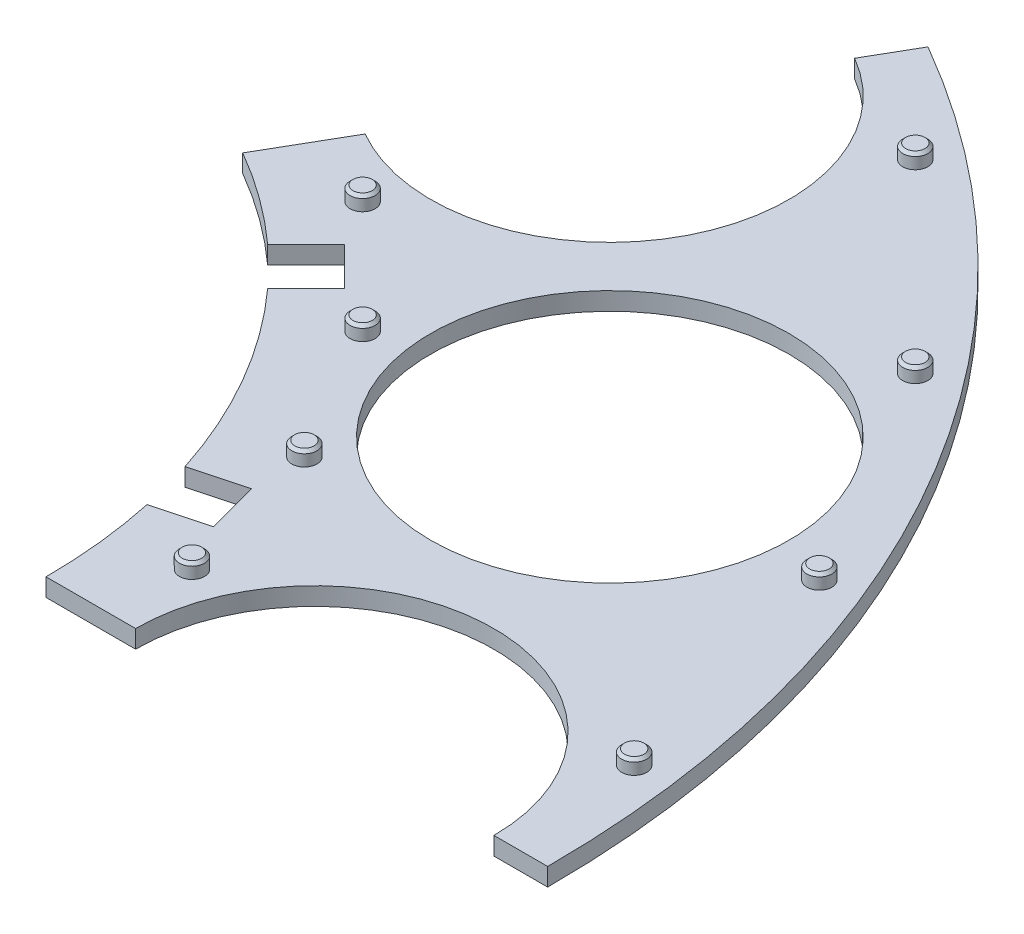
ISO-10303-21;
HEADER;
FILE_DESCRIPTION(('STEP AP214'),'2;1');
FILE_NAME('part.step','',(''),(''),'','','');
FILE_SCHEMA(('AUTOMOTIVE_DESIGN { 1 0 10303 214 1 1 1 1 }'));
ENDSEC;
DATA;
#1=APPLICATION_CONTEXT('core data for automotive mechanical design processes');
#2=APPLICATION_PROTOCOL_DEFINITION('international standard','automotive_design',2000,#1);
#3=PRODUCT_CONTEXT('',#1,'mechanical');
#4=PRODUCT('Part','Part','',(#3));
#5=PRODUCT_RELATED_PRODUCT_CATEGORY('part','',(#4));
#6=PRODUCT_DEFINITION_FORMATION('','',#4);
#7=PRODUCT_DEFINITION_CONTEXT('part definition',#1,'design');
#8=PRODUCT_DEFINITION('design','',#6,#7);
#9=PRODUCT_DEFINITION_SHAPE('','',#8);
#10=(LENGTH_UNIT() NAMED_UNIT(*) SI_UNIT(.MILLI.,.METRE.));
#11=(NAMED_UNIT(*) PLANE_ANGLE_UNIT() SI_UNIT($,.RADIAN.));
#12=(NAMED_UNIT(*) SI_UNIT($,.STERADIAN.) SOLID_ANGLE_UNIT());
#13=UNCERTAINTY_MEASURE_WITH_UNIT(LENGTH_MEASURE(1.E-05),#10,'distance_accuracy_value','');
#14=(GEOMETRIC_REPRESENTATION_CONTEXT(3) GLOBAL_UNCERTAINTY_ASSIGNED_CONTEXT((#13)) GLOBAL_UNIT_ASSIGNED_CONTEXT((#10,
#11,#12)) REPRESENTATION_CONTEXT('',''));
#15=CARTESIAN_POINT('',(0.,0.,0.));
#16=DIRECTION('',(0.,0.,1.));
#17=DIRECTION('',(1.,0.,0.));
#18=AXIS2_PLACEMENT_3D('',#15,#16,#17);
#19=CARTESIAN_POINT('',(0.,5.,0.));
#20=DIRECTION('',(0.,-1.,0.));
#21=DIRECTION('',(0.,0.,-1.));
#22=AXIS2_PLACEMENT_3D('',#19,#20,#21);
#23=CYLINDRICAL_SURFACE('',#22,150.);
#24=CARTESIAN_POINT('',(0.,0.,0.));
#25=DIRECTION('',(0.,-1.,0.));
#26=DIRECTION('',(0.,0.,1.));
#27=AXIS2_PLACEMENT_3D('',#24,#25,#26);
#28=CIRCLE('',#27,150.);
#29=CARTESIAN_POINT('',(74.9999999999997,0.,-129.903810567666));
#30=VERTEX_POINT('',#29);
#31=CARTESIAN_POINT('',(100.630050829792,0.,-111.236652547591));
#32=VERTEX_POINT('',#31);
#33=EDGE_CURVE('E177',#30,#32,#28,.T.);
#34=ORIENTED_EDGE('',*,*,#33,.T.);
#35=DIRECTION('',(0.,1.,0.));
#36=VECTOR('',#35,1.);
#37=CARTESIAN_POINT('',(100.630050829792,0.,-111.236652547591));
#38=LINE('',#37,#36);
#39=CARTESIAN_POINT('',(100.630050829792,5.,-111.236652547591));
#40=VERTEX_POINT('',#39);
#41=EDGE_CURVE('E357',#32,#40,#38,.T.);
#42=ORIENTED_EDGE('',*,*,#41,.T.);
#43=CARTESIAN_POINT('',(0.,5.,0.));
#44=DIRECTION('',(0.,-1.,0.));
#45=DIRECTION('',(0.,0.,1.));
#46=AXIS2_PLACEMENT_3D('',#43,#44,#45);
#47=CIRCLE('',#46,150.);
#48=CARTESIAN_POINT('',(74.9999999999997,5.,-129.903810567666));
#49=VERTEX_POINT('',#48);
#50=EDGE_CURVE('E305',#49,#40,#47,.T.);
#51=ORIENTED_EDGE('',*,*,#50,.F.);
#52=DIRECTION('',(0.,-1.,0.));
#53=VECTOR('',#52,1.);
#54=CARTESIAN_POINT('',(74.9999999999997,5.,-129.903810567666));
#55=LINE('',#54,#53);
#56=EDGE_CURVE('E197',#49,#30,#55,.T.);
#57=ORIENTED_EDGE('',*,*,#56,.T.);
#58=EDGE_LOOP('',(#34,#42,#51,#57));
#59=FACE_BOUND('',#58,.T.);
#60=ADVANCED_FACE('F39',(#59),#23,.F.);
#61=CARTESIAN_POINT('',(111.23665254759,5.,-100.630050829793));
#62=VERTEX_POINT('',#61);
#63=CARTESIAN_POINT('',(142.766506676515,5.,-46.0187415232604));
#64=VERTEX_POINT('',#63);
#65=EDGE_CURVE('E170',#62,#64,#47,.T.);
#66=ORIENTED_EDGE('',*,*,#65,.F.);
#67=DIRECTION('',(0.,1.,0.));
#68=VECTOR('',#67,1.);
#69=CARTESIAN_POINT('',(111.23665254759,0.,-100.630050829793));
#70=LINE('',#69,#68);
#71=CARTESIAN_POINT('',(111.23665254759,0.,-100.630050829793));
#72=VERTEX_POINT('',#71);
#73=EDGE_CURVE('E156',#72,#62,#70,.T.);
#74=ORIENTED_EDGE('',*,*,#73,.F.);
#75=CARTESIAN_POINT('',(142.766506676515,0.,-46.0187415232604));
#76=VERTEX_POINT('',#75);
#77=EDGE_CURVE('E168',#72,#76,#28,.T.);
#78=ORIENTED_EDGE('',*,*,#77,.T.);
#79=DIRECTION('',(0.,1.,0.));
#80=VECTOR('',#79,1.);
#81=CARTESIAN_POINT('',(142.766506676515,0.,-46.0187415232604));
#82=LINE('',#81,#80);
#83=EDGE_CURVE('E377',#76,#64,#82,.T.);
#84=ORIENTED_EDGE('',*,*,#83,.T.);
#85=EDGE_LOOP('',(#66,#74,#78,#84));
#86=FACE_BOUND('',#85,.T.);
#87=ADVANCED_FACE('F166',(#86),#23,.F.);
#88=CARTESIAN_POINT('',(150.,5.,0.));
#89=DIRECTION('',(0.,0.,-1.));
#90=DIRECTION('',(-1.,0.,0.));
#91=AXIS2_PLACEMENT_3D('',#88,#89,#90);
#92=PLANE('',#91);
#93=DIRECTION('',(1.,0.,0.));
#94=VECTOR('',#93,1.);
#95=CARTESIAN_POINT('',(150.,0.,0.));
#96=LINE('',#95,#94);
#97=CARTESIAN_POINT('',(150.,0.,0.));
#98=VERTEX_POINT('',#97);
#99=CARTESIAN_POINT('',(175.,0.,0.));
#100=VERTEX_POINT('',#99);
#101=EDGE_CURVE('E187',#98,#100,#96,.T.);
#102=ORIENTED_EDGE('',*,*,#101,.T.);
#103=DIRECTION('',(0.,1.,0.));
#104=VECTOR('',#103,1.);
#105=CARTESIAN_POINT('',(175.,0.,0.));
#106=LINE('',#105,#104);
#107=CARTESIAN_POINT('',(175.,5.,0.));
#108=VERTEX_POINT('',#107);
#109=EDGE_CURVE('E182',#100,#108,#106,.T.);
#110=ORIENTED_EDGE('',*,*,#109,.T.);
#111=DIRECTION('',(1.,0.,0.));
#112=VECTOR('',#111,1.);
#113=CARTESIAN_POINT('',(150.,5.,0.));
#114=LINE('',#113,#112);
#115=CARTESIAN_POINT('',(150.,5.,0.));
#116=VERTEX_POINT('',#115);
#117=EDGE_CURVE('E312',#116,#108,#114,.T.);
#118=ORIENTED_EDGE('',*,*,#117,.F.);
#119=DIRECTION('',(0.,-1.,0.));
#120=VECTOR('',#119,1.);
#121=CARTESIAN_POINT('',(150.,5.,0.));
#122=LINE('',#121,#120);
#123=EDGE_CURVE('E206',#116,#98,#122,.T.);
#124=ORIENTED_EDGE('',*,*,#123,.T.);
#125=EDGE_LOOP('',(#102,#110,#118,#124));
#126=FACE_BOUND('',#125,.T.);
#127=ADVANCED_FACE('F279',(#126),#92,.F.);
#128=CARTESIAN_POINT('',(144.999999999999,5.,-251.147367097488));
#129=DIRECTION('',(0.86602540378444,0.,0.499999999999998));
#130=DIRECTION('',(0.499999999999998,0.,-0.86602540378444));
#131=AXIS2_PLACEMENT_3D('',#128,#129,#130);
#132=PLANE('',#131);
#133=DIRECTION('',(-0.499999999999998,0.,0.86602540378444));
#134=VECTOR('',#133,1.);
#135=CARTESIAN_POINT('',(144.999999999999,0.,-251.147367097488));
#136=LINE('',#135,#134);
#137=CARTESIAN_POINT('',(144.999999999999,0.,-251.147367097488));
#138=VERTEX_POINT('',#137);
#139=CARTESIAN_POINT('',(137.499999999999,0.,-238.156986040721));
#140=VERTEX_POINT('',#139);
#141=EDGE_CURVE('E193',#138,#140,#136,.T.);
#142=ORIENTED_EDGE('',*,*,#141,.T.);
#143=DIRECTION('',(0.,1.,0.));
#144=VECTOR('',#143,1.);
#145=CARTESIAN_POINT('',(137.499999999999,0.,-238.156986040721));
#146=LINE('',#145,#144);
#147=CARTESIAN_POINT('',(137.499999999999,5.,-238.156986040721));
#148=VERTEX_POINT('',#147);
#149=EDGE_CURVE('E330',#140,#148,#146,.T.);
#150=ORIENTED_EDGE('',*,*,#149,.T.);
#151=DIRECTION('',(-0.499999999999998,0.,0.86602540378444));
#152=VECTOR('',#151,1.);
#153=CARTESIAN_POINT('',(144.999999999999,5.,-251.147367097488));
#154=LINE('',#153,#152);
#155=CARTESIAN_POINT('',(144.999999999999,5.,-251.147367097488));
#156=VERTEX_POINT('',#155);
#157=EDGE_CURVE('E185',#156,#148,#154,.T.);
#158=ORIENTED_EDGE('',*,*,#157,.F.);
#159=DIRECTION('',(0.,-1.,0.));
#160=VECTOR('',#159,1.);
#161=CARTESIAN_POINT('',(144.999999999999,5.,-251.147367097488));
#162=LINE('',#161,#160);
#163=EDGE_CURVE('E200',#156,#138,#162,.T.);
#164=ORIENTED_EDGE('',*,*,#163,.T.);
#165=EDGE_LOOP('',(#142,#150,#158,#164));
#166=FACE_BOUND('',#165,.T.);
#167=ADVANCED_FACE('F284',(#166),#132,.F.);
#168=CARTESIAN_POINT('',(146.648792353053,5.,-31.5298541289244));
#169=VERTEX_POINT('',#168);
#170=EDGE_CURVE('E196',#169,#116,#47,.T.);
#171=ORIENTED_EDGE('',*,*,#170,.F.);
#172=DIRECTION('',(0.,1.,0.));
#173=VECTOR('',#172,1.);
#174=CARTESIAN_POINT('',(146.648792353053,0.,-31.5298541289244));
#175=LINE('',#174,#173);
#176=CARTESIAN_POINT('',(146.648792353053,0.,-31.5298541289244));
#177=VERTEX_POINT('',#176);
#178=EDGE_CURVE('E298',#177,#169,#175,.T.);
#179=ORIENTED_EDGE('',*,*,#178,.F.);
#180=EDGE_CURVE('E178',#177,#98,#28,.T.);
#181=ORIENTED_EDGE('',*,*,#180,.T.);
#182=ORIENTED_EDGE('',*,*,#123,.F.);
#183=EDGE_LOOP('',(#171,#179,#181,#182));
#184=FACE_BOUND('',#183,.T.);
#185=ADVANCED_FACE('F275',(#184),#23,.F.);
#186=CARTESIAN_POINT('',(275.,5.,0.));
#187=VERTEX_POINT('',#186);
#188=CARTESIAN_POINT('',(290.,5.,0.));
#189=VERTEX_POINT('',#188);
#190=EDGE_CURVE('E309',#187,#189,#114,.T.);
#191=ORIENTED_EDGE('',*,*,#190,.F.);
#192=DIRECTION('',(0.,1.,0.));
#193=VECTOR('',#192,1.);
#194=CARTESIAN_POINT('',(275.,0.,0.));
#195=LINE('',#194,#193);
#196=CARTESIAN_POINT('',(275.,0.,0.));
#197=VERTEX_POINT('',#196);
#198=EDGE_CURVE('E332',#187,#197,#195,.F.);
#199=ORIENTED_EDGE('',*,*,#198,.T.);
#200=CARTESIAN_POINT('',(290.,0.,0.));
#201=VERTEX_POINT('',#200);
#202=EDGE_CURVE('E181',#197,#201,#96,.T.);
#203=ORIENTED_EDGE('',*,*,#202,.T.);
#204=DIRECTION('',(0.,-1.,0.));
#205=VECTOR('',#204,1.);
#206=CARTESIAN_POINT('',(290.,5.,0.));
#207=LINE('',#206,#205);
#208=EDGE_CURVE('E203',#189,#201,#207,.T.);
#209=ORIENTED_EDGE('',*,*,#208,.F.);
#210=EDGE_LOOP('',(#191,#199,#203,#209));
#211=FACE_BOUND('',#210,.T.);
#212=ADVANCED_FACE('F283',(#211),#92,.F.);
#213=CARTESIAN_POINT('',(0.,5.,0.));
#214=DIRECTION('',(0.,-1.,0.));
#215=DIRECTION('',(0.,0.,-1.));
#216=AXIS2_PLACEMENT_3D('',#213,#214,#215);
#217=CYLINDRICAL_SURFACE('',#216,290.);
#218=CARTESIAN_POINT('',(0.,0.,0.));
#219=DIRECTION('',(0.,1.,0.));
#220=DIRECTION('',(0.,0.,1.));
#221=AXIS2_PLACEMENT_3D('',#218,#219,#220);
#222=CIRCLE('',#221,290.);
#223=EDGE_CURVE('E190',#201,#138,#222,.T.);
#224=ORIENTED_EDGE('',*,*,#223,.T.);
#225=ORIENTED_EDGE('',*,*,#163,.F.);
#226=CARTESIAN_POINT('',(0.,5.,0.));
#227=DIRECTION('',(0.,1.,0.));
#228=DIRECTION('',(0.,0.,1.));
#229=AXIS2_PLACEMENT_3D('',#226,#227,#228);
#230=CIRCLE('',#229,290.);
#231=EDGE_CURVE('E316',#189,#156,#230,.T.);
#232=ORIENTED_EDGE('',*,*,#231,.F.);
#233=ORIENTED_EDGE('',*,*,#208,.T.);
#234=EDGE_LOOP('',(#224,#225,#232,#233));
#235=FACE_BOUND('',#234,.T.);
#236=ADVANCED_FACE('F290',(#235),#217,.T.);
#237=CARTESIAN_POINT('',(87.4999999999996,5.,-151.554445662277));
#238=VERTEX_POINT('',#237);
#239=EDGE_CURVE('E317',#238,#49,#154,.T.);
#240=ORIENTED_EDGE('',*,*,#239,.F.);
#241=DIRECTION('',(0.,1.,0.));
#242=VECTOR('',#241,1.);
#243=CARTESIAN_POINT('',(87.4999999999996,0.,-151.554445662277));
#244=LINE('',#243,#242);
#245=CARTESIAN_POINT('',(87.4999999999996,0.,-151.554445662277));
#246=VERTEX_POINT('',#245);
#247=EDGE_CURVE('E333',#238,#246,#244,.F.);
#248=ORIENTED_EDGE('',*,*,#247,.T.);
#249=EDGE_CURVE('E192',#246,#30,#136,.T.);
#250=ORIENTED_EDGE('',*,*,#249,.T.);
#251=ORIENTED_EDGE('',*,*,#56,.F.);
#252=EDGE_LOOP('',(#240,#248,#250,#251));
#253=FACE_BOUND('',#252,.T.);
#254=ADVANCED_FACE('F294',(#253),#132,.F.);
#255=CARTESIAN_POINT('',(0.,5.,0.));
#256=DIRECTION('',(0.,1.,0.));
#257=DIRECTION('',(0.,0.,1.));
#258=AXIS2_PLACEMENT_3D('',#255,#256,#257);
#259=PLANE('',#258);
#260=DIRECTION('',(-0.707106781186547,0.,0.707106781186548));
#261=VECTOR('',#260,1.);
#262=CARTESIAN_POINT('',(100.630050829792,5.,-111.236652547591));
#263=LINE('',#262,#261);
#264=CARTESIAN_POINT('',(111.369318036881,5.,-121.97591975468));
#265=VERTEX_POINT('',#264);
#266=EDGE_CURVE('E161',#265,#40,#263,.T.);
#267=ORIENTED_EDGE('',*,*,#266,.F.);
#268=DIRECTION('',(-0.707106781186549,0.,-0.707106781186546));
#269=VECTOR('',#268,1.);
#270=CARTESIAN_POINT('',(111.369318036881,5.,-121.97591975468));
#271=LINE('',#270,#269);
#272=CARTESIAN_POINT('',(121.975919754679,5.,-111.369318036881));
#273=VERTEX_POINT('',#272);
#274=EDGE_CURVE('E874',#273,#265,#271,.T.);
#275=ORIENTED_EDGE('',*,*,#274,.F.);
#276=DIRECTION('',(0.707106781186546,0.,-0.707106781186549));
#277=VECTOR('',#276,1.);
#278=CARTESIAN_POINT('',(121.975919754679,5.,-111.369318036881));
#279=LINE('',#278,#277);
#280=EDGE_CURVE('E388',#62,#273,#279,.T.);
#281=ORIENTED_EDGE('',*,*,#280,.F.);
#282=ORIENTED_EDGE('',*,*,#65,.T.);
#283=DIRECTION('',(-0.965925826289068,0.,0.258819045102521));
#284=VECTOR('',#283,1.);
#285=CARTESIAN_POINT('',(142.766506676515,5.,-46.0187415232604));
#286=LINE('',#285,#284);
#287=CARTESIAN_POINT('',(157.436618499427,5.,-49.9495861390841));
#288=VERTEX_POINT('',#287);
#289=EDGE_CURVE('E379',#288,#64,#286,.T.);
#290=ORIENTED_EDGE('',*,*,#289,.F.);
#291=DIRECTION('',(-0.258819045102521,0.,-0.965925826289068));
#292=VECTOR('',#291,1.);
#293=CARTESIAN_POINT('',(157.436618499427,5.,-49.9495861390841));
#294=LINE('',#293,#292);
#295=CARTESIAN_POINT('',(161.318904175965,5.,-35.4606987447481));
#296=VERTEX_POINT('',#295);
#297=EDGE_CURVE('E381',#296,#288,#294,.T.);
#298=ORIENTED_EDGE('',*,*,#297,.F.);
#299=DIRECTION('',(0.965925826289067,0.,-0.258819045102523));
#300=VECTOR('',#299,1.);
#301=CARTESIAN_POINT('',(161.318904175965,5.,-35.4606987447481));
#302=LINE('',#301,#300);
#303=EDGE_CURVE('E385',#169,#296,#302,.T.);
#304=ORIENTED_EDGE('',*,*,#303,.F.);
#305=ORIENTED_EDGE('',*,*,#170,.T.);
#306=ORIENTED_EDGE('',*,*,#117,.T.);
#307=CARTESIAN_POINT('',(225.,5.,0.));
#308=DIRECTION('',(0.,1.,0.));
#309=DIRECTION('',(0.,0.,1.));
#310=AXIS2_PLACEMENT_3D('',#307,#308,#309);
#311=CIRCLE('',#310,50.);
#312=EDGE_CURVE('E345',#187,#108,#311,.T.);
#313=ORIENTED_EDGE('',*,*,#312,.F.);
#314=ORIENTED_EDGE('',*,*,#190,.T.);
#315=ORIENTED_EDGE('',*,*,#231,.T.);
#316=ORIENTED_EDGE('',*,*,#157,.T.);
#317=CARTESIAN_POINT('',(112.499999999999,5.,-194.855715851499));
#318=DIRECTION('',(0.,1.,0.));
#319=DIRECTION('',(0.,0.,1.));
#320=AXIS2_PLACEMENT_3D('',#317,#318,#319);
#321=CIRCLE('',#320,50.);
#322=EDGE_CURVE('E327',#238,#148,#321,.T.);
#323=ORIENTED_EDGE('',*,*,#322,.F.);
#324=ORIENTED_EDGE('',*,*,#239,.T.);
#325=ORIENTED_EDGE('',*,*,#50,.T.);
#326=EDGE_LOOP('',(#267,#275,#281,#282,#290,#298,#304,#305,#306,#313,#314,#315,#316,#323,#324,#325));
#327=FACE_BOUND('',#326,.T.);
#328=CARTESIAN_POINT('',(258.68626910316,5.,-107.151361062226));
#329=DIRECTION('',(0.,1.,0.));
#330=DIRECTION('',(0.,0.,1.));
#331=AXIS2_PLACEMENT_3D('',#328,#329,#330);
#332=CIRCLE('',#331,3.50000000000002);
#333=CARTESIAN_POINT('',(258.68626910316,5.,-103.651361062226));
#334=VERTEX_POINT('',#333);
#335=EDGE_CURVE('E361',#334,#334,#332,.T.);
#336=ORIENTED_EDGE('',*,*,#335,.F.);
#337=EDGE_LOOP('',(#336));
#338=FACE_BOUND('',#337,.T.);
#339=CARTESIAN_POINT('',(222.138935281545,5.,-170.453200122442));
#340=DIRECTION('',(0.,1.,0.));
#341=DIRECTION('',(0.,0.,1.));
#342=AXIS2_PLACEMENT_3D('',#339,#340,#341);
#343=CIRCLE('',#342,3.49999999999999);
#344=CARTESIAN_POINT('',(222.138935281545,5.,-166.953200122442));
#345=VERTEX_POINT('',#344);
#346=EDGE_CURVE('E365',#345,#345,#343,.T.);
#347=ORIENTED_EDGE('',*,*,#346,.F.);
#348=EDGE_LOOP('',(#347));
#349=FACE_BOUND('',#348,.T.);
#350=CARTESIAN_POINT('',(170.453200122441,5.,-222.138935281546));
#351=DIRECTION('',(0.,1.,0.));
#352=DIRECTION('',(0.,0.,1.));
#353=AXIS2_PLACEMENT_3D('',#350,#351,#352);
#354=CIRCLE('',#353,3.49999999999999);
#355=CARTESIAN_POINT('',(170.453200122441,5.,-218.638935281546));
#356=VERTEX_POINT('',#355);
#357=EDGE_CURVE('E395',#356,#356,#354,.T.);
#358=ORIENTED_EDGE('',*,*,#357,.F.);
#359=EDGE_LOOP('',(#358));
#360=FACE_BOUND('',#359,.T.);
#361=CARTESIAN_POINT('',(103.489442931482,5.,-134.87006784951));
#362=DIRECTION('',(0.,1.,0.));
#363=DIRECTION('',(0.,0.,1.));
#364=AXIS2_PLACEMENT_3D('',#361,#362,#363);
#365=CIRCLE('',#364,3.50000000000001);
#366=CARTESIAN_POINT('',(103.489442931482,5.,-131.37006784951));
#367=VERTEX_POINT('',#366);
#368=EDGE_CURVE('E398',#367,#367,#365,.T.);
#369=ORIENTED_EDGE('',*,*,#368,.F.);
#370=EDGE_LOOP('',(#369));
#371=FACE_BOUND('',#370,.T.);
#372=CARTESIAN_POINT('',(134.87006784951,5.,-103.489442931483));
#373=DIRECTION('',(0.,1.,0.));
#374=DIRECTION('',(0.,0.,1.));
#375=AXIS2_PLACEMENT_3D('',#372,#373,#374);
#376=CIRCLE('',#375,3.49999999999999);
#377=CARTESIAN_POINT('',(134.87006784951,5.,-99.9894429314829));
#378=VERTEX_POINT('',#377);
#379=EDGE_CURVE('E401',#378,#378,#376,.T.);
#380=ORIENTED_EDGE('',*,*,#379,.F.);
#381=EDGE_LOOP('',(#380));
#382=FACE_BOUND('',#381,.T.);
#383=CARTESIAN_POINT('',(157.059520526919,5.,-65.0561835020656));
#384=DIRECTION('',(0.,1.,0.));
#385=DIRECTION('',(0.,0.,1.));
#386=AXIS2_PLACEMENT_3D('',#383,#384,#385);
#387=CIRCLE('',#386,3.49999999999999);
#388=CARTESIAN_POINT('',(157.059520526919,5.,-61.5561835020656));
#389=VERTEX_POINT('',#388);
#390=EDGE_CURVE('E404',#389,#389,#387,.T.);
#391=ORIENTED_EDGE('',*,*,#390,.F.);
#392=EDGE_LOOP('',(#391));
#393=FACE_BOUND('',#392,.T.);
#394=CARTESIAN_POINT('',(277.604561184667,5.,-36.5473338216147));
#395=DIRECTION('',(0.,1.,0.));
#396=DIRECTION('',(0.,0.,1.));
#397=AXIS2_PLACEMENT_3D('',#394,#395,#396);
#398=CIRCLE('',#397,3.50000000000002);
#399=CARTESIAN_POINT('',(277.604561184667,5.,-33.0473338216147));
#400=VERTEX_POINT('',#399);
#401=EDGE_CURVE('E407',#400,#400,#398,.T.);
#402=ORIENTED_EDGE('',*,*,#401,.F.);
#403=EDGE_LOOP('',(#402));
#404=FACE_BOUND('',#403,.T.);
#405=CARTESIAN_POINT('',(168.545626433548,5.,-22.1894526774089));
#406=DIRECTION('',(0.,1.,0.));
#407=DIRECTION('',(0.,0.,1.));
#408=AXIS2_PLACEMENT_3D('',#405,#406,#407);
#409=CIRCLE('',#408,3.49999999999999);
#410=CARTESIAN_POINT('',(168.545626433548,5.,-18.6894526774089));
#411=VERTEX_POINT('',#410);
#412=EDGE_CURVE('E410',#411,#411,#409,.T.);
#413=ORIENTED_EDGE('',*,*,#412,.F.);
#414=EDGE_LOOP('',(#413));
#415=FACE_BOUND('',#414,.T.);
#416=CARTESIAN_POINT('',(194.855715851499,5.,-112.5));
#417=DIRECTION('',(0.,1.,0.));
#418=DIRECTION('',(0.,0.,1.));
#419=AXIS2_PLACEMENT_3D('',#416,#417,#418);
#420=CIRCLE('',#419,50.);
#421=CARTESIAN_POINT('',(194.855715851499,5.,-62.5000000000003));
#422=VERTEX_POINT('',#421);
#423=EDGE_CURVE('E413',#422,#422,#420,.T.);
#424=ORIENTED_EDGE('',*,*,#423,.F.);
#425=EDGE_LOOP('',(#424));
#426=FACE_BOUND('',#425,.T.);
#427=ADVANCED_FACE('F325',(#327,#338,#349,#360,#371,#382,#393,#404,#415,#426),#259,.T.);
#428=CARTESIAN_POINT('',(0.,0.,0.));
#429=DIRECTION('',(0.,1.,0.));
#430=DIRECTION('',(0.,0.,1.));
#431=AXIS2_PLACEMENT_3D('',#428,#429,#430);
#432=PLANE('',#431);
#433=CARTESIAN_POINT('',(194.855715851499,0.,-112.5));
#434=DIRECTION('',(0.,1.,0.));
#435=DIRECTION('',(0.,0.,1.));
#436=AXIS2_PLACEMENT_3D('',#433,#434,#435);
#437=CIRCLE('',#436,50.);
#438=CARTESIAN_POINT('',(194.855715851499,0.,-62.5000000000003));
#439=VERTEX_POINT('',#438);
#440=EDGE_CURVE('E346',#439,#439,#437,.T.);
#441=ORIENTED_EDGE('',*,*,#440,.T.);
#442=EDGE_LOOP('',(#441));
#443=FACE_BOUND('',#442,.T.);
#444=DIRECTION('',(-0.707106781186549,0.,-0.707106781186546));
#445=VECTOR('',#444,1.);
#446=CARTESIAN_POINT('',(111.369318036881,0.,-121.97591975468));
#447=LINE('',#446,#445);
#448=CARTESIAN_POINT('',(121.975919754679,0.,-111.369318036881));
#449=VERTEX_POINT('',#448);
#450=CARTESIAN_POINT('',(111.369318036881,0.,-121.97591975468));
#451=VERTEX_POINT('',#450);
#452=EDGE_CURVE('E55',#449,#451,#447,.T.);
#453=ORIENTED_EDGE('',*,*,#452,.T.);
#454=DIRECTION('',(-0.707106781186547,0.,0.707106781186548));
#455=VECTOR('',#454,1.);
#456=CARTESIAN_POINT('',(100.630050829792,0.,-111.236652547591));
#457=LINE('',#456,#455);
#458=EDGE_CURVE('E171',#451,#32,#457,.T.);
#459=ORIENTED_EDGE('',*,*,#458,.T.);
#460=ORIENTED_EDGE('',*,*,#33,.F.);
#461=ORIENTED_EDGE('',*,*,#249,.F.);
#462=CARTESIAN_POINT('',(112.499999999999,0.,-194.855715851499));
#463=DIRECTION('',(0.,1.,0.));
#464=DIRECTION('',(0.,0.,1.));
#465=AXIS2_PLACEMENT_3D('',#462,#463,#464);
#466=CIRCLE('',#465,50.);
#467=EDGE_CURVE('E209',#246,#140,#466,.T.);
#468=ORIENTED_EDGE('',*,*,#467,.T.);
#469=ORIENTED_EDGE('',*,*,#141,.F.);
#470=ORIENTED_EDGE('',*,*,#223,.F.);
#471=ORIENTED_EDGE('',*,*,#202,.F.);
#472=CARTESIAN_POINT('',(225.,0.,0.));
#473=DIRECTION('',(0.,1.,0.));
#474=DIRECTION('',(0.,0.,1.));
#475=AXIS2_PLACEMENT_3D('',#472,#473,#474);
#476=CIRCLE('',#475,50.);
#477=EDGE_CURVE('E347',#197,#100,#476,.T.);
#478=ORIENTED_EDGE('',*,*,#477,.T.);
#479=ORIENTED_EDGE('',*,*,#101,.F.);
#480=ORIENTED_EDGE('',*,*,#180,.F.);
#481=DIRECTION('',(0.965925826289067,0.,-0.258819045102523));
#482=VECTOR('',#481,1.);
#483=CARTESIAN_POINT('',(161.318904175965,0.,-35.4606987447481));
#484=LINE('',#483,#482);
#485=CARTESIAN_POINT('',(161.318904175965,0.,-35.4606987447481));
#486=VERTEX_POINT('',#485);
#487=EDGE_CURVE('E382',#177,#486,#484,.T.);
#488=ORIENTED_EDGE('',*,*,#487,.T.);
#489=DIRECTION('',(-0.258819045102521,0.,-0.965925826289068));
#490=VECTOR('',#489,1.);
#491=CARTESIAN_POINT('',(157.436618499427,0.,-49.9495861390841));
#492=LINE('',#491,#490);
#493=CARTESIAN_POINT('',(157.436618499427,0.,-49.9495861390841));
#494=VERTEX_POINT('',#493);
#495=EDGE_CURVE('E63',#486,#494,#492,.T.);
#496=ORIENTED_EDGE('',*,*,#495,.T.);
#497=DIRECTION('',(-0.965925826289068,0.,0.258819045102521));
#498=VECTOR('',#497,1.);
#499=CARTESIAN_POINT('',(142.766506676515,0.,-46.0187415232604));
#500=LINE('',#499,#498);
#501=EDGE_CURVE('E176',#494,#76,#500,.T.);
#502=ORIENTED_EDGE('',*,*,#501,.T.);
#503=ORIENTED_EDGE('',*,*,#77,.F.);
#504=DIRECTION('',(0.707106781186546,0.,-0.707106781186549));
#505=VECTOR('',#504,1.);
#506=CARTESIAN_POINT('',(121.975919754679,0.,-111.369318036881));
#507=LINE('',#506,#505);
#508=EDGE_CURVE('E152',#72,#449,#507,.T.);
#509=ORIENTED_EDGE('',*,*,#508,.T.);
#510=EDGE_LOOP('',(#453,#459,#460,#461,#468,#469,#470,#471,#478,#479,#480,#488,#496,#502,#503,#509));
#511=FACE_BOUND('',#510,.T.);
#512=ADVANCED_FACE('F174',(#443,#511),#432,.F.);
#513=CARTESIAN_POINT('',(112.499999999999,0.,-194.855715851499));
#514=DIRECTION('',(0.,1.,0.));
#515=DIRECTION('',(0.,0.,1.));
#516=AXIS2_PLACEMENT_3D('',#513,#514,#515);
#517=CYLINDRICAL_SURFACE('',#516,50.);
#518=ORIENTED_EDGE('',*,*,#467,.F.);
#519=ORIENTED_EDGE('',*,*,#247,.F.);
#520=ORIENTED_EDGE('',*,*,#322,.T.);
#521=ORIENTED_EDGE('',*,*,#149,.F.);
#522=EDGE_LOOP('',(#518,#519,#520,#521));
#523=FACE_BOUND('',#522,.T.);
#524=ADVANCED_FACE('F354',(#523),#517,.F.);
#525=CARTESIAN_POINT('',(194.855715851499,0.,-112.5));
#526=DIRECTION('',(0.,1.,0.));
#527=DIRECTION('',(0.,0.,1.));
#528=AXIS2_PLACEMENT_3D('',#525,#526,#527);
#529=CYLINDRICAL_SURFACE('',#528,50.);
#530=ORIENTED_EDGE('',*,*,#440,.F.);
#531=EDGE_LOOP('',(#530));
#532=FACE_BOUND('',#531,.T.);
#533=ORIENTED_EDGE('',*,*,#423,.T.);
#534=EDGE_LOOP('',(#533));
#535=FACE_BOUND('',#534,.T.);
#536=ADVANCED_FACE('F421',(#532,#535),#529,.F.);
#537=CARTESIAN_POINT('',(225.,0.,0.));
#538=DIRECTION('',(0.,1.,0.));
#539=DIRECTION('',(0.,0.,1.));
#540=AXIS2_PLACEMENT_3D('',#537,#538,#539);
#541=CYLINDRICAL_SURFACE('',#540,50.);
#542=ORIENTED_EDGE('',*,*,#477,.F.);
#543=ORIENTED_EDGE('',*,*,#198,.F.);
#544=ORIENTED_EDGE('',*,*,#312,.T.);
#545=ORIENTED_EDGE('',*,*,#109,.F.);
#546=EDGE_LOOP('',(#542,#543,#544,#545));
#547=FACE_BOUND('',#546,.T.);
#548=ADVANCED_FACE('F418',(#547),#541,.F.);
#549=CARTESIAN_POINT('',(168.545626433548,9.,-22.1894526774089));
#550=DIRECTION('',(0.,-1.,0.));
#551=DIRECTION('',(0.,0.,-1.));
#552=AXIS2_PLACEMENT_3D('',#549,#550,#551);
#553=CYLINDRICAL_SURFACE('',#552,3.49999999999999);
#554=CARTESIAN_POINT('',(168.545626433548,8.20000000000002,-22.1894526774089));
#555=DIRECTION('',(0.,1.,0.));
#556=DIRECTION('',(0.,0.,1.));
#557=AXIS2_PLACEMENT_3D('',#554,#555,#556);
#558=CIRCLE('',#557,3.49999999999999);
#559=CARTESIAN_POINT('',(168.545626433548,8.20000000000002,-25.6894526774089));
#560=VERTEX_POINT('',#559);
#561=EDGE_CURVE('E251',#560,#560,#558,.F.);
#562=ORIENTED_EDGE('',*,*,#561,.T.);
#563=EDGE_LOOP('',(#562));
#564=FACE_BOUND('',#563,.T.);
#565=ORIENTED_EDGE('',*,*,#412,.T.);
#566=EDGE_LOOP('',(#565));
#567=FACE_BOUND('',#566,.T.);
#568=ADVANCED_FACE('F420',(#564,#567),#553,.T.);
#569=CARTESIAN_POINT('',(168.545626433548,9.,-22.1894526774089));
#570=DIRECTION('',(0.,1.,0.));
#571=DIRECTION('',(0.,0.,1.));
#572=AXIS2_PLACEMENT_3D('',#569,#570,#571);
#573=PLANE('',#572);
#574=CARTESIAN_POINT('',(168.545626433548,9.,-22.1894526774089));
#575=DIRECTION('',(0.,1.,0.));
#576=DIRECTION('',(0.,0.,1.));
#577=AXIS2_PLACEMENT_3D('',#574,#575,#576);
#578=CIRCLE('',#577,2.70000000000001);
#579=CARTESIAN_POINT('',(168.545626433548,9.,-24.8894526774089));
#580=VERTEX_POINT('',#579);
#581=EDGE_CURVE('E248',#580,#580,#578,.T.);
#582=ORIENTED_EDGE('',*,*,#581,.T.);
#583=EDGE_LOOP('',(#582));
#584=FACE_BOUND('',#583,.T.);
#585=ADVANCED_FACE('F427',(#584),#573,.T.);
#586=CARTESIAN_POINT('',(277.604561184667,9.,-36.5473338216147));
#587=DIRECTION('',(0.,-1.,0.));
#588=DIRECTION('',(0.,0.,-1.));
#589=AXIS2_PLACEMENT_3D('',#586,#587,#588);
#590=CYLINDRICAL_SURFACE('',#589,3.50000000000002);
#591=CARTESIAN_POINT('',(277.604561184667,8.2,-36.5473338216147));
#592=DIRECTION('',(0.,1.,0.));
#593=DIRECTION('',(0.,0.,1.));
#594=AXIS2_PLACEMENT_3D('',#591,#592,#593);
#595=CIRCLE('',#594,3.50000000000002);
#596=CARTESIAN_POINT('',(277.604561184667,8.2,-33.0473338216147));
#597=VERTEX_POINT('',#596);
#598=EDGE_CURVE('E215',#597,#597,#595,.F.);
#599=ORIENTED_EDGE('',*,*,#598,.T.);
#600=EDGE_LOOP('',(#599));
#601=FACE_BOUND('',#600,.T.);
#602=ORIENTED_EDGE('',*,*,#401,.T.);
#603=EDGE_LOOP('',(#602));
#604=FACE_BOUND('',#603,.T.);
#605=ADVANCED_FACE('F490',(#601,#604),#590,.T.);
#606=CARTESIAN_POINT('',(277.604561184667,9.,-36.5473338216147));
#607=DIRECTION('',(0.,1.,0.));
#608=DIRECTION('',(0.,0.,1.));
#609=AXIS2_PLACEMENT_3D('',#606,#607,#608);
#610=PLANE('',#609);
#611=CARTESIAN_POINT('',(277.604561184667,9.,-36.5473338216147));
#612=DIRECTION('',(0.,1.,0.));
#613=DIRECTION('',(0.,0.,1.));
#614=AXIS2_PLACEMENT_3D('',#611,#612,#613);
#615=CIRCLE('',#614,2.70000000000004);
#616=CARTESIAN_POINT('',(277.604561184667,9.,-33.8473338216147));
#617=VERTEX_POINT('',#616);
#618=EDGE_CURVE('E212',#617,#617,#615,.T.);
#619=ORIENTED_EDGE('',*,*,#618,.T.);
#620=EDGE_LOOP('',(#619));
#621=FACE_BOUND('',#620,.T.);
#622=ADVANCED_FACE('F501',(#621),#610,.T.);
#623=CARTESIAN_POINT('',(157.059520526919,9.,-65.0561835020656));
#624=DIRECTION('',(0.,-1.,0.));
#625=DIRECTION('',(0.,0.,-1.));
#626=AXIS2_PLACEMENT_3D('',#623,#624,#625);
#627=CYLINDRICAL_SURFACE('',#626,3.49999999999999);
#628=CARTESIAN_POINT('',(157.059520526919,8.2,-65.0561835020656));
#629=DIRECTION('',(0.,1.,0.));
#630=DIRECTION('',(0.,0.,1.));
#631=AXIS2_PLACEMENT_3D('',#628,#629,#630);
#632=CIRCLE('',#631,3.49999999999999);
#633=CARTESIAN_POINT('',(157.059520526919,8.2,-61.5561835020656));
#634=VERTEX_POINT('',#633);
#635=EDGE_CURVE('E221',#634,#634,#632,.F.);
#636=ORIENTED_EDGE('',*,*,#635,.T.);
#637=EDGE_LOOP('',(#636));
#638=FACE_BOUND('',#637,.T.);
#639=ORIENTED_EDGE('',*,*,#390,.T.);
#640=EDGE_LOOP('',(#639));
#641=FACE_BOUND('',#640,.T.);
#642=ADVANCED_FACE('F512',(#638,#641),#627,.T.);
#643=CARTESIAN_POINT('',(157.059520526919,9.,-65.0561835020656));
#644=DIRECTION('',(0.,1.,0.));
#645=DIRECTION('',(0.,0.,1.));
#646=AXIS2_PLACEMENT_3D('',#643,#644,#645);
#647=PLANE('',#646);
#648=CARTESIAN_POINT('',(157.059520526919,9.,-65.0561835020656));
#649=DIRECTION('',(0.,1.,0.));
#650=DIRECTION('',(0.,0.,1.));
#651=AXIS2_PLACEMENT_3D('',#648,#649,#650);
#652=CIRCLE('',#651,2.70000000000001);
#653=CARTESIAN_POINT('',(157.059520526919,9.,-62.3561835020655));
#654=VERTEX_POINT('',#653);
#655=EDGE_CURVE('E218',#654,#654,#652,.T.);
#656=ORIENTED_EDGE('',*,*,#655,.T.);
#657=EDGE_LOOP('',(#656));
#658=FACE_BOUND('',#657,.T.);
#659=ADVANCED_FACE('F523',(#658),#647,.T.);
#660=CARTESIAN_POINT('',(134.87006784951,9.,-103.489442931483));
#661=DIRECTION('',(0.,-1.,0.));
#662=DIRECTION('',(0.,0.,-1.));
#663=AXIS2_PLACEMENT_3D('',#660,#661,#662);
#664=CYLINDRICAL_SURFACE('',#663,3.49999999999999);
#665=CARTESIAN_POINT('',(134.87006784951,8.2,-103.489442931483));
#666=DIRECTION('',(0.,1.,0.));
#667=DIRECTION('',(0.,0.,1.));
#668=AXIS2_PLACEMENT_3D('',#665,#666,#667);
#669=CIRCLE('',#668,3.49999999999999);
#670=CARTESIAN_POINT('',(134.87006784951,8.2,-99.9894429314829));
#671=VERTEX_POINT('',#670);
#672=EDGE_CURVE('E227',#671,#671,#669,.F.);
#673=ORIENTED_EDGE('',*,*,#672,.T.);
#674=EDGE_LOOP('',(#673));
#675=FACE_BOUND('',#674,.T.);
#676=ORIENTED_EDGE('',*,*,#379,.T.);
#677=EDGE_LOOP('',(#676));
#678=FACE_BOUND('',#677,.T.);
#679=ADVANCED_FACE('F534',(#675,#678),#664,.T.);
#680=CARTESIAN_POINT('',(134.87006784951,9.,-103.489442931483));
#681=DIRECTION('',(0.,1.,0.));
#682=DIRECTION('',(0.,0.,1.));
#683=AXIS2_PLACEMENT_3D('',#680,#681,#682);
#684=PLANE('',#683);
#685=CARTESIAN_POINT('',(134.87006784951,9.,-103.489442931483));
#686=DIRECTION('',(0.,1.,0.));
#687=DIRECTION('',(0.,0.,1.));
#688=AXIS2_PLACEMENT_3D('',#685,#686,#687);
#689=CIRCLE('',#688,2.70000000000001);
#690=CARTESIAN_POINT('',(134.87006784951,9.,-100.789442931483));
#691=VERTEX_POINT('',#690);
#692=EDGE_CURVE('E224',#691,#691,#689,.T.);
#693=ORIENTED_EDGE('',*,*,#692,.T.);
#694=EDGE_LOOP('',(#693));
#695=FACE_BOUND('',#694,.T.);
#696=ADVANCED_FACE('F545',(#695),#684,.T.);
#697=CARTESIAN_POINT('',(103.489442931482,9.,-134.87006784951));
#698=DIRECTION('',(0.,-1.,0.));
#699=DIRECTION('',(0.,0.,-1.));
#700=AXIS2_PLACEMENT_3D('',#697,#698,#699);
#701=CYLINDRICAL_SURFACE('',#700,3.50000000000001);
#702=CARTESIAN_POINT('',(103.489442931482,8.20000000000001,-134.87006784951));
#703=DIRECTION('',(0.,1.,0.));
#704=DIRECTION('',(0.,0.,1.));
#705=AXIS2_PLACEMENT_3D('',#702,#703,#704);
#706=CIRCLE('',#705,3.50000000000001);
#707=CARTESIAN_POINT('',(103.489442931482,8.20000000000001,-131.37006784951));
#708=VERTEX_POINT('',#707);
#709=EDGE_CURVE('E11',#708,#708,#706,.F.);
#710=ORIENTED_EDGE('',*,*,#709,.T.);
#711=EDGE_LOOP('',(#710));
#712=FACE_BOUND('',#711,.T.);
#713=ORIENTED_EDGE('',*,*,#368,.T.);
#714=EDGE_LOOP('',(#713));
#715=FACE_BOUND('',#714,.T.);
#716=ADVANCED_FACE('F556',(#712,#715),#701,.T.);
#717=CARTESIAN_POINT('',(103.489442931482,9.,-134.87006784951));
#718=DIRECTION('',(0.,1.,0.));
#719=DIRECTION('',(0.,0.,1.));
#720=AXIS2_PLACEMENT_3D('',#717,#718,#719);
#721=PLANE('',#720);
#722=CARTESIAN_POINT('',(103.489442931482,9.,-134.87006784951));
#723=DIRECTION('',(0.,1.,0.));
#724=DIRECTION('',(0.,0.,1.));
#725=AXIS2_PLACEMENT_3D('',#722,#723,#724);
#726=CIRCLE('',#725,2.70000000000004);
#727=CARTESIAN_POINT('',(103.489442931482,9.,-132.17006784951));
#728=VERTEX_POINT('',#727);
#729=EDGE_CURVE('E48',#728,#728,#726,.T.);
#730=ORIENTED_EDGE('',*,*,#729,.T.);
#731=EDGE_LOOP('',(#730));
#732=FACE_BOUND('',#731,.T.);
#733=ADVANCED_FACE('F256',(#732),#721,.T.);
#734=CARTESIAN_POINT('',(170.453200122441,9.,-222.138935281546));
#735=DIRECTION('',(0.,-1.,0.));
#736=DIRECTION('',(0.,0.,-1.));
#737=AXIS2_PLACEMENT_3D('',#734,#735,#736);
#738=CYLINDRICAL_SURFACE('',#737,3.49999999999999);
#739=CARTESIAN_POINT('',(170.453200122441,8.2,-222.138935281546));
#740=DIRECTION('',(0.,1.,0.));
#741=DIRECTION('',(0.,0.,1.));
#742=AXIS2_PLACEMENT_3D('',#739,#740,#741);
#743=CIRCLE('',#742,3.49999999999999);
#744=CARTESIAN_POINT('',(170.453200122441,8.2,-218.638935281546));
#745=VERTEX_POINT('',#744);
#746=EDGE_CURVE('E233',#745,#745,#743,.F.);
#747=ORIENTED_EDGE('',*,*,#746,.T.);
#748=EDGE_LOOP('',(#747));
#749=FACE_BOUND('',#748,.T.);
#750=ORIENTED_EDGE('',*,*,#357,.T.);
#751=EDGE_LOOP('',(#750));
#752=FACE_BOUND('',#751,.T.);
#753=ADVANCED_FACE('F577',(#749,#752),#738,.T.);
#754=CARTESIAN_POINT('',(170.453200122441,9.,-222.138935281546));
#755=DIRECTION('',(0.,1.,0.));
#756=DIRECTION('',(0.,0.,1.));
#757=AXIS2_PLACEMENT_3D('',#754,#755,#756);
#758=PLANE('',#757);
#759=CARTESIAN_POINT('',(170.453200122441,9.,-222.138935281546));
#760=DIRECTION('',(0.,1.,0.));
#761=DIRECTION('',(0.,0.,1.));
#762=AXIS2_PLACEMENT_3D('',#759,#760,#761);
#763=CIRCLE('',#762,2.70000000000001);
#764=CARTESIAN_POINT('',(170.453200122441,9.,-219.438935281546));
#765=VERTEX_POINT('',#764);
#766=EDGE_CURVE('E230',#765,#765,#763,.T.);
#767=ORIENTED_EDGE('',*,*,#766,.T.);
#768=EDGE_LOOP('',(#767));
#769=FACE_BOUND('',#768,.T.);
#770=ADVANCED_FACE('F587',(#769),#758,.T.);
#771=CARTESIAN_POINT('',(222.138935281545,9.,-170.453200122442));
#772=DIRECTION('',(0.,-1.,0.));
#773=DIRECTION('',(0.,0.,-1.));
#774=AXIS2_PLACEMENT_3D('',#771,#772,#773);
#775=CYLINDRICAL_SURFACE('',#774,3.49999999999999);
#776=CARTESIAN_POINT('',(222.138935281545,8.2,-170.453200122442));
#777=DIRECTION('',(0.,1.,0.));
#778=DIRECTION('',(0.,0.,1.));
#779=AXIS2_PLACEMENT_3D('',#776,#777,#778);
#780=CIRCLE('',#779,3.49999999999999);
#781=CARTESIAN_POINT('',(222.138935281545,8.2,-166.953200122442));
#782=VERTEX_POINT('',#781);
#783=EDGE_CURVE('E239',#782,#782,#780,.F.);
#784=ORIENTED_EDGE('',*,*,#783,.T.);
#785=EDGE_LOOP('',(#784));
#786=FACE_BOUND('',#785,.T.);
#787=ORIENTED_EDGE('',*,*,#346,.T.);
#788=EDGE_LOOP('',(#787));
#789=FACE_BOUND('',#788,.T.);
#790=ADVANCED_FACE('F598',(#786,#789),#775,.T.);
#791=CARTESIAN_POINT('',(222.138935281545,9.,-170.453200122442));
#792=DIRECTION('',(0.,1.,0.));
#793=DIRECTION('',(0.,0.,1.));
#794=AXIS2_PLACEMENT_3D('',#791,#792,#793);
#795=PLANE('',#794);
#796=CARTESIAN_POINT('',(222.138935281545,9.,-170.453200122442));
#797=DIRECTION('',(0.,1.,0.));
#798=DIRECTION('',(0.,0.,1.));
#799=AXIS2_PLACEMENT_3D('',#796,#797,#798);
#800=CIRCLE('',#799,2.70000000000001);
#801=CARTESIAN_POINT('',(222.138935281545,9.,-167.753200122442));
#802=VERTEX_POINT('',#801);
#803=EDGE_CURVE('E236',#802,#802,#800,.T.);
#804=ORIENTED_EDGE('',*,*,#803,.T.);
#805=EDGE_LOOP('',(#804));
#806=FACE_BOUND('',#805,.T.);
#807=ADVANCED_FACE('F609',(#806),#795,.T.);
#808=CARTESIAN_POINT('',(258.68626910316,9.,-107.151361062226));
#809=DIRECTION('',(0.,-1.,0.));
#810=DIRECTION('',(0.,0.,-1.));
#811=AXIS2_PLACEMENT_3D('',#808,#809,#810);
#812=CYLINDRICAL_SURFACE('',#811,3.50000000000002);
#813=CARTESIAN_POINT('',(258.68626910316,8.2,-107.151361062226));
#814=DIRECTION('',(0.,1.,0.));
#815=DIRECTION('',(0.,0.,1.));
#816=AXIS2_PLACEMENT_3D('',#813,#814,#815);
#817=CIRCLE('',#816,3.50000000000002);
#818=CARTESIAN_POINT('',(258.68626910316,8.2,-103.651361062226));
#819=VERTEX_POINT('',#818);
#820=EDGE_CURVE('E245',#819,#819,#817,.F.);
#821=ORIENTED_EDGE('',*,*,#820,.T.);
#822=EDGE_LOOP('',(#821));
#823=FACE_BOUND('',#822,.T.);
#824=ORIENTED_EDGE('',*,*,#335,.T.);
#825=EDGE_LOOP('',(#824));
#826=FACE_BOUND('',#825,.T.);
#827=ADVANCED_FACE('F620',(#823,#826),#812,.T.);
#828=CARTESIAN_POINT('',(258.68626910316,9.,-107.151361062226));
#829=DIRECTION('',(0.,1.,0.));
#830=DIRECTION('',(0.,0.,1.));
#831=AXIS2_PLACEMENT_3D('',#828,#829,#830);
#832=PLANE('',#831);
#833=CARTESIAN_POINT('',(258.68626910316,9.,-107.151361062226));
#834=DIRECTION('',(0.,1.,0.));
#835=DIRECTION('',(0.,0.,1.));
#836=AXIS2_PLACEMENT_3D('',#833,#834,#835);
#837=CIRCLE('',#836,2.70000000000004);
#838=CARTESIAN_POINT('',(258.68626910316,9.,-104.451361062226));
#839=VERTEX_POINT('',#838);
#840=EDGE_CURVE('E242',#839,#839,#837,.T.);
#841=ORIENTED_EDGE('',*,*,#840,.T.);
#842=EDGE_LOOP('',(#841));
#843=FACE_BOUND('',#842,.T.);
#844=ADVANCED_FACE('F631',(#843),#832,.T.);
#845=CARTESIAN_POINT('',(277.604561184667,9.,-36.5473338216147));
#846=DIRECTION('',(0.,-1.,0.));
#847=DIRECTION('',(0.,0.,-1.));
#848=AXIS2_PLACEMENT_3D('',#845,#846,#847);
#849=CONICAL_SURFACE('',#848,2.70000000000004,0.785398163397439);
#850=ORIENTED_EDGE('',*,*,#598,.F.);
#851=EDGE_LOOP('',(#850));
#852=FACE_BOUND('',#851,.T.);
#853=ORIENTED_EDGE('',*,*,#618,.F.);
#854=EDGE_LOOP('',(#853));
#855=FACE_BOUND('',#854,.T.);
#856=ADVANCED_FACE('F642',(#852,#855),#849,.T.);
#857=CARTESIAN_POINT('',(157.059520526919,9.,-65.0561835020656));
#858=DIRECTION('',(0.,-1.,0.));
#859=DIRECTION('',(0.,0.,-1.));
#860=AXIS2_PLACEMENT_3D('',#857,#858,#859);
#861=CONICAL_SURFACE('',#860,2.70000000000001,0.785398163397438);
#862=ORIENTED_EDGE('',*,*,#635,.F.);
#863=EDGE_LOOP('',(#862));
#864=FACE_BOUND('',#863,.T.);
#865=ORIENTED_EDGE('',*,*,#655,.F.);
#866=EDGE_LOOP('',(#865));
#867=FACE_BOUND('',#866,.T.);
#868=ADVANCED_FACE('F653',(#864,#867),#861,.T.);
#869=CARTESIAN_POINT('',(134.87006784951,9.,-103.489442931483));
#870=DIRECTION('',(0.,-1.,0.));
#871=DIRECTION('',(0.,0.,-1.));
#872=AXIS2_PLACEMENT_3D('',#869,#870,#871);
#873=CONICAL_SURFACE('',#872,2.70000000000001,0.785398163397438);
#874=ORIENTED_EDGE('',*,*,#672,.F.);
#875=EDGE_LOOP('',(#874));
#876=FACE_BOUND('',#875,.T.);
#877=ORIENTED_EDGE('',*,*,#692,.F.);
#878=EDGE_LOOP('',(#877));
#879=FACE_BOUND('',#878,.T.);
#880=ADVANCED_FACE('F663',(#876,#879),#873,.T.);
#881=CARTESIAN_POINT('',(170.453200122441,9.,-222.138935281546));
#882=DIRECTION('',(0.,-1.,0.));
#883=DIRECTION('',(0.,0.,-1.));
#884=AXIS2_PLACEMENT_3D('',#881,#882,#883);
#885=CONICAL_SURFACE('',#884,2.70000000000001,0.785398163397438);
#886=ORIENTED_EDGE('',*,*,#746,.F.);
#887=EDGE_LOOP('',(#886));
#888=FACE_BOUND('',#887,.T.);
#889=ORIENTED_EDGE('',*,*,#766,.F.);
#890=EDGE_LOOP('',(#889));
#891=FACE_BOUND('',#890,.T.);
#892=ADVANCED_FACE('F674',(#888,#891),#885,.T.);
#893=CARTESIAN_POINT('',(222.138935281545,9.,-170.453200122442));
#894=DIRECTION('',(0.,-1.,0.));
#895=DIRECTION('',(0.,0.,-1.));
#896=AXIS2_PLACEMENT_3D('',#893,#894,#895);
#897=CONICAL_SURFACE('',#896,2.70000000000001,0.785398163397438);
#898=ORIENTED_EDGE('',*,*,#783,.F.);
#899=EDGE_LOOP('',(#898));
#900=FACE_BOUND('',#899,.T.);
#901=ORIENTED_EDGE('',*,*,#803,.F.);
#902=EDGE_LOOP('',(#901));
#903=FACE_BOUND('',#902,.T.);
#904=ADVANCED_FACE('F685',(#900,#903),#897,.T.);
#905=CARTESIAN_POINT('',(258.68626910316,9.,-107.151361062226));
#906=DIRECTION('',(0.,-1.,0.));
#907=DIRECTION('',(0.,0.,-1.));
#908=AXIS2_PLACEMENT_3D('',#905,#906,#907);
#909=CONICAL_SURFACE('',#908,2.70000000000004,0.785398163397439);
#910=ORIENTED_EDGE('',*,*,#820,.F.);
#911=EDGE_LOOP('',(#910));
#912=FACE_BOUND('',#911,.T.);
#913=ORIENTED_EDGE('',*,*,#840,.F.);
#914=EDGE_LOOP('',(#913));
#915=FACE_BOUND('',#914,.T.);
#916=ADVANCED_FACE('F269',(#912,#915),#909,.T.);
#917=CARTESIAN_POINT('',(168.545626433548,9.,-22.1894526774089));
#918=DIRECTION('',(0.,-1.,0.));
#919=DIRECTION('',(0.,0.,-1.));
#920=AXIS2_PLACEMENT_3D('',#917,#918,#919);
#921=CONICAL_SURFACE('',#920,2.70000000000001,0.785398163397453);
#922=CARTESIAN_POINT('',(168.545626433548,8.20000000000002,-25.6894526774089));
#923=CARTESIAN_POINT('',(168.545626433548,8.20833333333336,-25.6811193440756));
#924=CARTESIAN_POINT('',(168.545626433548,8.21666666666669,-25.6727860107423));
#925=CARTESIAN_POINT('',(168.545626433548,8.23333333333335,-25.6561193440756));
#926=CARTESIAN_POINT('',(168.545626433548,8.24166666666669,-25.6477860107423));
#927=CARTESIAN_POINT('',(168.545626433548,8.25833333333335,-25.6311193440756));
#928=CARTESIAN_POINT('',(168.545626433548,8.26666666666669,-25.6227860107423));
#929=CARTESIAN_POINT('',(168.545626433548,8.28333333333335,-25.6061193440756));
#930=CARTESIAN_POINT('',(168.545626433548,8.29166666666669,-25.5977860107423));
#931=CARTESIAN_POINT('',(168.545626433548,8.30833333333335,-25.5811193440756));
#932=CARTESIAN_POINT('',(168.545626433548,8.31666666666668,-25.5727860107423));
#933=CARTESIAN_POINT('',(168.545626433548,8.33333333333335,-25.5561193440756));
#934=CARTESIAN_POINT('',(168.545626433548,8.34166666666669,-25.5477860107423));
#935=CARTESIAN_POINT('',(168.545626433548,8.35833333333335,-25.5311193440756));
#936=CARTESIAN_POINT('',(168.545626433548,8.36666666666668,-25.5227860107423));
#937=CARTESIAN_POINT('',(168.545626433548,8.38333333333335,-25.5061193440756));
#938=CARTESIAN_POINT('',(168.545626433548,8.39166666666668,-25.4977860107423));
#939=CARTESIAN_POINT('',(168.545626433548,8.40833333333335,-25.4811193440756));
#940=CARTESIAN_POINT('',(168.545626433548,8.41666666666668,-25.4727860107423));
#941=CARTESIAN_POINT('',(168.545626433548,8.43333333333335,-25.4561193440756));
#942=CARTESIAN_POINT('',(168.545626433548,8.44166666666668,-25.4477860107423));
#943=CARTESIAN_POINT('',(168.545626433548,8.45833333333335,-25.4311193440756));
#944=CARTESIAN_POINT('',(168.545626433548,8.46666666666668,-25.4227860107423));
#945=CARTESIAN_POINT('',(168.545626433548,8.48333333333335,-25.4061193440756));
#946=CARTESIAN_POINT('',(168.545626433548,8.49166666666668,-25.3977860107423));
#947=CARTESIAN_POINT('',(168.545626433548,8.50833333333335,-25.3811193440756));
#948=CARTESIAN_POINT('',(168.545626433548,8.51666666666668,-25.3727860107423));
#949=CARTESIAN_POINT('',(168.545626433548,8.53333333333335,-25.3561193440756));
#950=CARTESIAN_POINT('',(168.545626433548,8.54166666666668,-25.3477860107423));
#951=CARTESIAN_POINT('',(168.545626433548,8.55833333333334,-25.3311193440756));
#952=CARTESIAN_POINT('',(168.545626433548,8.56666666666668,-25.3227860107423));
#953=CARTESIAN_POINT('',(168.545626433548,8.58333333333335,-25.3061193440756));
#954=CARTESIAN_POINT('',(168.545626433548,8.59166666666668,-25.2977860107423));
#955=CARTESIAN_POINT('',(168.545626433548,8.60833333333334,-25.2811193440756));
#956=CARTESIAN_POINT('',(168.545626433548,8.61666666666668,-25.2727860107423));
#957=CARTESIAN_POINT('',(168.545626433548,8.63333333333334,-25.2561193440756));
#958=CARTESIAN_POINT('',(168.545626433548,8.64166666666668,-25.2477860107423));
#959=CARTESIAN_POINT('',(168.545626433548,8.65833333333334,-25.2311193440756));
#960=CARTESIAN_POINT('',(168.545626433548,8.66666666666668,-25.2227860107423));
#961=CARTESIAN_POINT('',(168.545626433548,8.68333333333334,-25.2061193440756));
#962=CARTESIAN_POINT('',(168.545626433548,8.69166666666667,-25.1977860107423));
#963=CARTESIAN_POINT('',(168.545626433548,8.70833333333334,-25.1811193440756));
#964=CARTESIAN_POINT('',(168.545626433548,8.71666666666667,-25.1727860107423));
#965=CARTESIAN_POINT('',(168.545626433548,8.73333333333334,-25.1561193440756));
#966=CARTESIAN_POINT('',(168.545626433548,8.74166666666668,-25.1477860107423));
#967=CARTESIAN_POINT('',(168.545626433548,8.75833333333334,-25.1311193440756));
#968=CARTESIAN_POINT('',(168.545626433548,8.76666666666667,-25.1227860107423));
#969=CARTESIAN_POINT('',(168.545626433548,8.78333333333334,-25.1061193440756));
#970=CARTESIAN_POINT('',(168.545626433548,8.79166666666667,-25.0977860107423));
#971=CARTESIAN_POINT('',(168.545626433548,8.80833333333334,-25.0811193440756));
#972=CARTESIAN_POINT('',(168.545626433548,8.81666666666667,-25.0727860107423));
#973=CARTESIAN_POINT('',(168.545626433548,8.83333333333334,-25.0561193440756));
#974=CARTESIAN_POINT('',(168.545626433548,8.84166666666667,-25.0477860107423));
#975=CARTESIAN_POINT('',(168.545626433548,8.85833333333334,-25.0311193440756));
#976=CARTESIAN_POINT('',(168.545626433548,8.86666666666667,-25.0227860107423));
#977=CARTESIAN_POINT('',(168.545626433548,8.88333333333334,-25.0061193440756));
#978=CARTESIAN_POINT('',(168.545626433548,8.89166666666667,-24.9977860107423));
#979=CARTESIAN_POINT('',(168.545626433548,8.90833333333333,-24.9811193440756));
#980=CARTESIAN_POINT('',(168.545626433548,8.91666666666667,-24.9727860107423));
#981=CARTESIAN_POINT('',(168.545626433548,8.93333333333334,-24.9561193440756));
#982=CARTESIAN_POINT('',(168.545626433548,8.94166666666667,-24.9477860107423));
#983=CARTESIAN_POINT('',(168.545626433548,8.95833333333334,-24.9311193440756));
#984=CARTESIAN_POINT('',(168.545626433548,8.96666666666667,-24.9227860107423));
#985=CARTESIAN_POINT('',(168.545626433548,8.98333333333333,-24.9061193440756));
#986=CARTESIAN_POINT('',(168.545626433548,8.99166666666667,-24.8977860107423));
#987=CARTESIAN_POINT('',(168.545626433548,9.,-24.8894526774089));
#988=B_SPLINE_CURVE_WITH_KNOTS('',3,(#922,#923,#924,#925,#926,#927,#928,#929,#930,#931,#932,
#933,#934,#935,#936,#937,#938,#939,#940,#941,#942,#943,#944,#945,#946,#947,#948,#949,#950,#951,
#952,#953,#954,#955,#956,#957,#958,#959,#960,#961,#962,#963,#964,#965,#966,#967,#968,#969,#970,
#971,#972,#973,#974,#975,#976,#977,#978,#979,#980,#981,#982,#983,#984,#985,#986,#987),
.UNSPECIFIED.,.F.,.F.,(4,2,2,2,2,2,2,2,2,2,2,2,2,2,2,2,2,2,2,2,2,2,2,2,2,2,2,2,2,2,2,2,4),(0.,
0.0353553390593284,0.0707106781186556,0.10606601717798,0.141421356237307,0.176776695296635,
0.212132034355961,0.247487373415288,0.282842712474615,0.31819805153394,0.353553390593267,
0.388908729652595,0.42426406871192,0.459619407771247,0.494974746830574,0.530330085889899,
0.565685424949226,0.601040764008555,0.636396103067879,0.671751442127206,0.707106781186534,
0.742462120245858,0.777817459305187,0.813172798364514,0.848528137423839,0.883883476483166,
0.919238815542493,0.954594154601819,0.989949493661146,1.02530483272047,1.0606601717798,
1.09601551083913,1.13137084989845),.UNSPECIFIED.);
#989=EDGE_CURVE('BSEAM260',#560,#580,#988,.T.);
#990=ORIENTED_EDGE('',*,*,#561,.F.);
#991=ORIENTED_EDGE('',*,*,#581,.F.);
#992=ORIENTED_EDGE('',*,*,#989,.T.);
#993=ORIENTED_EDGE('',*,*,#989,.F.);
#994=EDGE_LOOP('',(#990,#992,#991,#993));
#995=FACE_BOUND('',#994,.T.);
#996=ADVANCED_FACE('F260',(#995),#921,.T.);
#997=CARTESIAN_POINT('',(103.489442931482,9.,-134.87006784951));
#998=DIRECTION('',(0.,-1.,0.));
#999=DIRECTION('',(0.,0.,-1.));
#1000=AXIS2_PLACEMENT_3D('',#997,#998,#999);
#1001=CONICAL_SURFACE('',#1000,2.70000000000004,0.785398163397438);
#1002=ORIENTED_EDGE('',*,*,#709,.F.);
#1003=EDGE_LOOP('',(#1002));
#1004=FACE_BOUND('',#1003,.T.);
#1005=ORIENTED_EDGE('',*,*,#729,.F.);
#1006=EDGE_LOOP('',(#1005));
#1007=FACE_BOUND('',#1006,.T.);
#1008=ADVANCED_FACE('F42',(#1004,#1007),#1001,.T.);
#1009=CARTESIAN_POINT('',(142.766506676515,0.,-46.0187415232604));
#1010=DIRECTION('',(-0.258819045102521,0.,-0.965925826289068));
#1011=DIRECTION('',(-0.965925826289068,0.,0.258819045102521));
#1012=AXIS2_PLACEMENT_3D('',#1009,#1010,#1011);
#1013=PLANE('',#1012);
#1014=ORIENTED_EDGE('',*,*,#289,.T.);
#1015=ORIENTED_EDGE('',*,*,#83,.F.);
#1016=ORIENTED_EDGE('',*,*,#501,.F.);
#1017=DIRECTION('',(0.,1.,0.));
#1018=VECTOR('',#1017,1.);
#1019=CARTESIAN_POINT('',(157.436618499427,0.,-49.9495861390841));
#1020=LINE('',#1019,#1018);
#1021=EDGE_CURVE('E375',#494,#288,#1020,.T.);
#1022=ORIENTED_EDGE('',*,*,#1021,.T.);
#1023=EDGE_LOOP('',(#1014,#1015,#1016,#1022));
#1024=FACE_BOUND('',#1023,.T.);
#1025=ADVANCED_FACE('F259',(#1024),#1013,.F.);
#1026=CARTESIAN_POINT('',(157.436618499427,0.,-49.9495861390841));
#1027=DIRECTION('',(0.965925826289068,0.,-0.258819045102521));
#1028=DIRECTION('',(-0.258819045102521,0.,-0.965925826289068));
#1029=AXIS2_PLACEMENT_3D('',#1026,#1027,#1028);
#1030=PLANE('',#1029);
#1031=ORIENTED_EDGE('',*,*,#297,.T.);
#1032=ORIENTED_EDGE('',*,*,#1021,.F.);
#1033=ORIENTED_EDGE('',*,*,#495,.F.);
#1034=DIRECTION('',(0.,1.,0.));
#1035=VECTOR('',#1034,1.);
#1036=CARTESIAN_POINT('',(161.318904175965,0.,-35.4606987447481));
#1037=LINE('',#1036,#1035);
#1038=EDGE_CURVE('E373',#486,#296,#1037,.T.);
#1039=ORIENTED_EDGE('',*,*,#1038,.T.);
#1040=EDGE_LOOP('',(#1031,#1032,#1033,#1039));
#1041=FACE_BOUND('',#1040,.T.);
#1042=ADVANCED_FACE('F266',(#1041),#1030,.F.);
#1043=CARTESIAN_POINT('',(161.318904175965,0.,-35.4606987447481));
#1044=DIRECTION('',(0.258819045102523,0.,0.965925826289068));
#1045=DIRECTION('',(0.965925826289068,0.,-0.258819045102524));
#1046=AXIS2_PLACEMENT_3D('',#1043,#1044,#1045);
#1047=PLANE('',#1046);
#1048=ORIENTED_EDGE('',*,*,#303,.T.);
#1049=ORIENTED_EDGE('',*,*,#1038,.F.);
#1050=ORIENTED_EDGE('',*,*,#487,.F.);
#1051=ORIENTED_EDGE('',*,*,#178,.T.);
#1052=EDGE_LOOP('',(#1048,#1049,#1050,#1051));
#1053=FACE_BOUND('',#1052,.T.);
#1054=ADVANCED_FACE('F821',(#1053),#1047,.F.);
#1055=CARTESIAN_POINT('',(100.630050829792,0.,-111.236652547591));
#1056=DIRECTION('',(-0.707106781186548,0.,-0.707106781186547));
#1057=DIRECTION('',(-0.707106781186547,0.,0.707106781186548));
#1058=AXIS2_PLACEMENT_3D('',#1055,#1056,#1057);
#1059=PLANE('',#1058);
#1060=ORIENTED_EDGE('',*,*,#266,.T.);
#1061=ORIENTED_EDGE('',*,*,#41,.F.);
#1062=ORIENTED_EDGE('',*,*,#458,.F.);
#1063=DIRECTION('',(0.,1.,0.));
#1064=VECTOR('',#1063,1.);
#1065=CARTESIAN_POINT('',(111.369318036881,0.,-121.97591975468));
#1066=LINE('',#1065,#1064);
#1067=EDGE_CURVE('E362',#451,#265,#1066,.T.);
#1068=ORIENTED_EDGE('',*,*,#1067,.T.);
#1069=EDGE_LOOP('',(#1060,#1061,#1062,#1068));
#1070=FACE_BOUND('',#1069,.T.);
#1071=ADVANCED_FACE('F830',(#1070),#1059,.F.);
#1072=CARTESIAN_POINT('',(111.369318036881,0.,-121.97591975468));
#1073=DIRECTION('',(0.707106781186546,0.,-0.707106781186549));
#1074=DIRECTION('',(-0.707106781186549,0.,-0.707106781186546));
#1075=AXIS2_PLACEMENT_3D('',#1072,#1073,#1074);
#1076=PLANE('',#1075);
#1077=ORIENTED_EDGE('',*,*,#274,.T.);
#1078=ORIENTED_EDGE('',*,*,#1067,.F.);
#1079=ORIENTED_EDGE('',*,*,#452,.F.);
#1080=DIRECTION('',(0.,1.,0.));
#1081=VECTOR('',#1080,1.);
#1082=CARTESIAN_POINT('',(121.975919754679,0.,-111.369318036881));
#1083=LINE('',#1082,#1081);
#1084=EDGE_CURVE('E158',#449,#273,#1083,.T.);
#1085=ORIENTED_EDGE('',*,*,#1084,.T.);
#1086=EDGE_LOOP('',(#1077,#1078,#1079,#1085));
#1087=FACE_BOUND('',#1086,.T.);
#1088=ADVANCED_FACE('F840',(#1087),#1076,.F.);
#1089=CARTESIAN_POINT('',(121.975919754679,0.,-111.369318036881));
#1090=DIRECTION('',(0.707106781186549,0.,0.707106781186546));
#1091=DIRECTION('',(0.707106781186546,0.,-0.707106781186549));
#1092=AXIS2_PLACEMENT_3D('',#1089,#1090,#1091);
#1093=PLANE('',#1092);
#1094=ORIENTED_EDGE('',*,*,#280,.T.);
#1095=ORIENTED_EDGE('',*,*,#1084,.F.);
#1096=ORIENTED_EDGE('',*,*,#508,.F.);
#1097=ORIENTED_EDGE('',*,*,#73,.T.);
#1098=EDGE_LOOP('',(#1094,#1095,#1096,#1097));
#1099=FACE_BOUND('',#1098,.T.);
#1100=ADVANCED_FACE('F155',(#1099),#1093,.F.);
#1101=CLOSED_SHELL('',(#60,#87,#127,#167,#185,#212,#236,#254,#427,#512,#524,#536,#548,#568,#585,
#605,#622,#642,#659,#679,#696,#716,#733,#753,#770,#790,#807,#827,#844,#856,#868,#880,#892,#904,
#916,#996,#1008,#1025,#1042,#1054,#1071,#1088,#1100));
#1102=MANIFOLD_SOLID_BREP('B2',#1101);
#1103=ADVANCED_BREP_SHAPE_REPRESENTATION('',(#18,#1102),#14);
#1104=SHAPE_DEFINITION_REPRESENTATION(#9,#1103);
ENDSEC;
END-ISO-10303-21;
